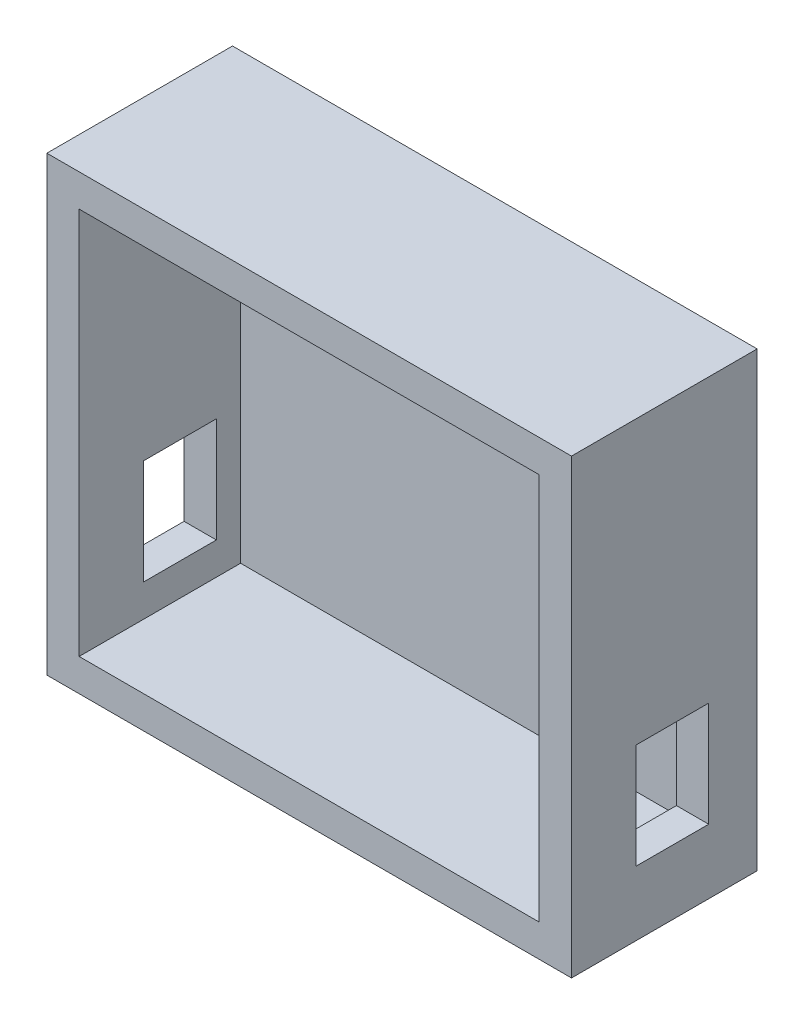
ISO-10303-21;
HEADER;
FILE_DESCRIPTION(('STEP AP214'),'2;1');
FILE_NAME('part.step','',(''),(''),'','','');
FILE_SCHEMA(('AUTOMOTIVE_DESIGN { 1 0 10303 214 1 1 1 1 }'));
ENDSEC;
DATA;
#1=APPLICATION_CONTEXT('core data for automotive mechanical design processes');
#2=APPLICATION_PROTOCOL_DEFINITION('international standard','automotive_design',2000,#1);
#3=PRODUCT_CONTEXT('',#1,'mechanical');
#4=PRODUCT('Part','Part','',(#3));
#5=PRODUCT_RELATED_PRODUCT_CATEGORY('part','',(#4));
#6=PRODUCT_DEFINITION_FORMATION('','',#4);
#7=PRODUCT_DEFINITION_CONTEXT('part definition',#1,'design');
#8=PRODUCT_DEFINITION('design','',#6,#7);
#9=PRODUCT_DEFINITION_SHAPE('','',#8);
#10=(LENGTH_UNIT() NAMED_UNIT(*) SI_UNIT(.MILLI.,.METRE.));
#11=(NAMED_UNIT(*) PLANE_ANGLE_UNIT() SI_UNIT($,.RADIAN.));
#12=(NAMED_UNIT(*) SI_UNIT($,.STERADIAN.) SOLID_ANGLE_UNIT());
#13=UNCERTAINTY_MEASURE_WITH_UNIT(LENGTH_MEASURE(1.E-05),#10,'distance_accuracy_value','');
#14=(GEOMETRIC_REPRESENTATION_CONTEXT(3) GLOBAL_UNCERTAINTY_ASSIGNED_CONTEXT((#13)) GLOBAL_UNIT_ASSIGNED_CONTEXT((#10,
#11,#12)) REPRESENTATION_CONTEXT('',''));
#15=CARTESIAN_POINT('',(0.,0.,0.));
#16=DIRECTION('',(0.,0.,1.));
#17=DIRECTION('',(1.,0.,0.));
#18=AXIS2_PLACEMENT_3D('',#15,#16,#17);
#19=CARTESIAN_POINT('',(32.5,28.,23.));
#20=DIRECTION('',(-1.,0.,0.));
#21=DIRECTION('',(0.,0.,1.));
#22=AXIS2_PLACEMENT_3D('',#19,#20,#21);
#23=PLANE('',#22);
#24=DIRECTION('',(0.,0.,-1.));
#25=VECTOR('',#24,1.);
#26=CARTESIAN_POINT('',(32.5,-6.99999999999998,15.));
#27=LINE('',#26,#25);
#28=CARTESIAN_POINT('',(32.5,-6.99999999999998,15.));
#29=VERTEX_POINT('',#28);
#30=CARTESIAN_POINT('',(32.5,-6.99999999999998,6.));
#31=VERTEX_POINT('',#30);
#32=EDGE_CURVE('E169',#29,#31,#27,.T.);
#33=ORIENTED_EDGE('',*,*,#32,.T.);
#34=DIRECTION('',(0.,-1.,0.));
#35=VECTOR('',#34,1.);
#36=CARTESIAN_POINT('',(32.5,-6.99999999999998,6.));
#37=LINE('',#36,#35);
#38=CARTESIAN_POINT('',(32.5,-20.,6.));
#39=VERTEX_POINT('',#38);
#40=EDGE_CURVE('E152',#31,#39,#37,.T.);
#41=ORIENTED_EDGE('',*,*,#40,.T.);
#42=DIRECTION('',(0.,0.,1.));
#43=VECTOR('',#42,1.);
#44=CARTESIAN_POINT('',(32.5,-20.,15.));
#45=LINE('',#44,#43);
#46=CARTESIAN_POINT('',(32.5,-20.,15.));
#47=VERTEX_POINT('',#46);
#48=EDGE_CURVE('E162',#39,#47,#45,.T.);
#49=ORIENTED_EDGE('',*,*,#48,.T.);
#50=DIRECTION('',(0.,1.,0.));
#51=VECTOR('',#50,1.);
#52=CARTESIAN_POINT('',(32.5,-6.99999999999998,15.));
#53=LINE('',#52,#51);
#54=EDGE_CURVE('E47',#47,#29,#53,.T.);
#55=ORIENTED_EDGE('',*,*,#54,.T.);
#56=EDGE_LOOP('',(#33,#41,#49,#55));
#57=FACE_BOUND('',#56,.T.);
#58=DIRECTION('',(0.,1.,0.));
#59=VECTOR('',#58,1.);
#60=CARTESIAN_POINT('',(32.5,28.,0.));
#61=LINE('',#60,#59);
#62=CARTESIAN_POINT('',(32.5,-28.,0.));
#63=VERTEX_POINT('',#62);
#64=CARTESIAN_POINT('',(32.5,28.,0.));
#65=VERTEX_POINT('',#64);
#66=EDGE_CURVE('E227',#63,#65,#61,.T.);
#67=ORIENTED_EDGE('',*,*,#66,.T.);
#68=DIRECTION('',(0.,0.,-1.));
#69=VECTOR('',#68,1.);
#70=CARTESIAN_POINT('',(32.5,28.,23.));
#71=LINE('',#70,#69);
#72=CARTESIAN_POINT('',(32.5,28.,23.));
#73=VERTEX_POINT('',#72);
#74=EDGE_CURVE('E260',#73,#65,#71,.T.);
#75=ORIENTED_EDGE('',*,*,#74,.F.);
#76=DIRECTION('',(0.,1.,0.));
#77=VECTOR('',#76,1.);
#78=CARTESIAN_POINT('',(32.5,28.,23.));
#79=LINE('',#78,#77);
#80=CARTESIAN_POINT('',(32.5,-28.,23.));
#81=VERTEX_POINT('',#80);
#82=EDGE_CURVE('E234',#81,#73,#79,.T.);
#83=ORIENTED_EDGE('',*,*,#82,.F.);
#84=DIRECTION('',(0.,0.,-1.));
#85=VECTOR('',#84,1.);
#86=CARTESIAN_POINT('',(32.5,-28.,23.));
#87=LINE('',#86,#85);
#88=EDGE_CURVE('E244',#81,#63,#87,.T.);
#89=ORIENTED_EDGE('',*,*,#88,.T.);
#90=EDGE_LOOP('',(#67,#75,#83,#89));
#91=FACE_BOUND('',#90,.T.);
#92=ADVANCED_FACE('F33',(#57,#91),#23,.F.);
#93=CARTESIAN_POINT('',(-32.5,28.,23.));
#94=DIRECTION('',(0.,-1.,0.));
#95=DIRECTION('',(0.,0.,-1.));
#96=AXIS2_PLACEMENT_3D('',#93,#94,#95);
#97=PLANE('',#96);
#98=DIRECTION('',(-1.,0.,0.));
#99=VECTOR('',#98,1.);
#100=CARTESIAN_POINT('',(-32.5,28.,0.));
#101=LINE('',#100,#99);
#102=CARTESIAN_POINT('',(-32.5,28.,0.));
#103=VERTEX_POINT('',#102);
#104=EDGE_CURVE('E247',#65,#103,#101,.T.);
#105=ORIENTED_EDGE('',*,*,#104,.T.);
#106=DIRECTION('',(0.,0.,-1.));
#107=VECTOR('',#106,1.);
#108=CARTESIAN_POINT('',(-32.5,28.,23.));
#109=LINE('',#108,#107);
#110=CARTESIAN_POINT('',(-32.5,28.,23.));
#111=VERTEX_POINT('',#110);
#112=EDGE_CURVE('E257',#111,#103,#109,.T.);
#113=ORIENTED_EDGE('',*,*,#112,.F.);
#114=DIRECTION('',(-1.,0.,0.));
#115=VECTOR('',#114,1.);
#116=CARTESIAN_POINT('',(-32.5,28.,23.));
#117=LINE('',#116,#115);
#118=EDGE_CURVE('E237',#73,#111,#117,.T.);
#119=ORIENTED_EDGE('',*,*,#118,.F.);
#120=ORIENTED_EDGE('',*,*,#74,.T.);
#121=EDGE_LOOP('',(#105,#113,#119,#120));
#122=FACE_BOUND('',#121,.T.);
#123=ADVANCED_FACE('F299',(#122),#97,.F.);
#124=CARTESIAN_POINT('',(-32.5,28.,23.));
#125=DIRECTION('',(1.,0.,0.));
#126=DIRECTION('',(0.,1.,0.));
#127=AXIS2_PLACEMENT_3D('',#124,#125,#126);
#128=PLANE('',#127);
#129=DIRECTION('',(0.,0.,1.));
#130=VECTOR('',#129,1.);
#131=CARTESIAN_POINT('',(-32.5,-20.,15.));
#132=LINE('',#131,#130);
#133=CARTESIAN_POINT('',(-32.5,-20.,6.));
#134=VERTEX_POINT('',#133);
#135=CARTESIAN_POINT('',(-32.5,-20.,15.));
#136=VERTEX_POINT('',#135);
#137=EDGE_CURVE('E179',#134,#136,#132,.T.);
#138=ORIENTED_EDGE('',*,*,#137,.F.);
#139=DIRECTION('',(0.,-1.,0.));
#140=VECTOR('',#139,1.);
#141=CARTESIAN_POINT('',(-32.5,-7.,6.));
#142=LINE('',#141,#140);
#143=CARTESIAN_POINT('',(-32.5,-7.,6.));
#144=VERTEX_POINT('',#143);
#145=EDGE_CURVE('E55',#144,#134,#142,.T.);
#146=ORIENTED_EDGE('',*,*,#145,.F.);
#147=DIRECTION('',(0.,0.,-1.));
#148=VECTOR('',#147,1.);
#149=CARTESIAN_POINT('',(-32.5,-6.99999999999999,15.));
#150=LINE('',#149,#148);
#151=CARTESIAN_POINT('',(-32.5,-6.99999999999999,15.));
#152=VERTEX_POINT('',#151);
#153=EDGE_CURVE('E170',#152,#144,#150,.T.);
#154=ORIENTED_EDGE('',*,*,#153,.F.);
#155=DIRECTION('',(0.,1.,0.));
#156=VECTOR('',#155,1.);
#157=CARTESIAN_POINT('',(-32.5,-6.99999999999999,15.));
#158=LINE('',#157,#156);
#159=EDGE_CURVE('E173',#136,#152,#158,.T.);
#160=ORIENTED_EDGE('',*,*,#159,.F.);
#161=EDGE_LOOP('',(#138,#146,#154,#160));
#162=FACE_BOUND('',#161,.T.);
#163=DIRECTION('',(0.,-1.,0.));
#164=VECTOR('',#163,1.);
#165=CARTESIAN_POINT('',(-32.5,28.,0.));
#166=LINE('',#165,#164);
#167=CARTESIAN_POINT('',(-32.5,-28.,0.));
#168=VERTEX_POINT('',#167);
#169=EDGE_CURVE('E249',#103,#168,#166,.T.);
#170=ORIENTED_EDGE('',*,*,#169,.T.);
#171=DIRECTION('',(0.,0.,-1.));
#172=VECTOR('',#171,1.);
#173=CARTESIAN_POINT('',(-32.5,-28.,23.));
#174=LINE('',#173,#172);
#175=CARTESIAN_POINT('',(-32.5,-28.,23.));
#176=VERTEX_POINT('',#175);
#177=EDGE_CURVE('E254',#176,#168,#174,.T.);
#178=ORIENTED_EDGE('',*,*,#177,.F.);
#179=DIRECTION('',(0.,-1.,0.));
#180=VECTOR('',#179,1.);
#181=CARTESIAN_POINT('',(-32.5,28.,23.));
#182=LINE('',#181,#180);
#183=EDGE_CURVE('E240',#111,#176,#182,.T.);
#184=ORIENTED_EDGE('',*,*,#183,.F.);
#185=ORIENTED_EDGE('',*,*,#112,.T.);
#186=EDGE_LOOP('',(#170,#178,#184,#185));
#187=FACE_BOUND('',#186,.T.);
#188=ADVANCED_FACE('F283',(#162,#187),#128,.F.);
#189=CARTESIAN_POINT('',(-32.5,-28.,23.));
#190=DIRECTION('',(0.,1.,0.));
#191=DIRECTION('',(0.,0.,1.));
#192=AXIS2_PLACEMENT_3D('',#189,#190,#191);
#193=PLANE('',#192);
#194=DIRECTION('',(1.,0.,0.));
#195=VECTOR('',#194,1.);
#196=CARTESIAN_POINT('',(-32.5,-28.,0.));
#197=LINE('',#196,#195);
#198=EDGE_CURVE('E238',#168,#63,#197,.T.);
#199=ORIENTED_EDGE('',*,*,#198,.T.);
#200=ORIENTED_EDGE('',*,*,#88,.F.);
#201=DIRECTION('',(1.,0.,0.));
#202=VECTOR('',#201,1.);
#203=CARTESIAN_POINT('',(-32.5,-28.,23.));
#204=LINE('',#203,#202);
#205=EDGE_CURVE('E242',#176,#81,#204,.T.);
#206=ORIENTED_EDGE('',*,*,#205,.F.);
#207=ORIENTED_EDGE('',*,*,#177,.T.);
#208=EDGE_LOOP('',(#199,#200,#206,#207));
#209=FACE_BOUND('',#208,.T.);
#210=ADVANCED_FACE('F307',(#209),#193,.F.);
#211=CARTESIAN_POINT('',(0.,0.,23.));
#212=DIRECTION('',(0.,0.,1.));
#213=DIRECTION('',(1.,0.,0.));
#214=AXIS2_PLACEMENT_3D('',#211,#212,#213);
#215=PLANE('',#214);
#216=DIRECTION('',(0.,1.,0.));
#217=VECTOR('',#216,1.);
#218=CARTESIAN_POINT('',(28.5,24.,23.));
#219=LINE('',#218,#217);
#220=CARTESIAN_POINT('',(28.5,-24.,23.));
#221=VERTEX_POINT('',#220);
#222=CARTESIAN_POINT('',(28.5,24.,23.));
#223=VERTEX_POINT('',#222);
#224=EDGE_CURVE('E201',#221,#223,#219,.T.);
#225=ORIENTED_EDGE('',*,*,#224,.F.);
#226=DIRECTION('',(1.,0.,0.));
#227=VECTOR('',#226,1.);
#228=CARTESIAN_POINT('',(-28.5,-24.,23.));
#229=LINE('',#228,#227);
#230=CARTESIAN_POINT('',(-28.5,-24.,23.));
#231=VERTEX_POINT('',#230);
#232=EDGE_CURVE('E206',#231,#221,#229,.T.);
#233=ORIENTED_EDGE('',*,*,#232,.F.);
#234=DIRECTION('',(0.,-1.,0.));
#235=VECTOR('',#234,1.);
#236=CARTESIAN_POINT('',(-28.5,24.,23.));
#237=LINE('',#236,#235);
#238=CARTESIAN_POINT('',(-28.5,24.,23.));
#239=VERTEX_POINT('',#238);
#240=EDGE_CURVE('E220',#239,#231,#237,.T.);
#241=ORIENTED_EDGE('',*,*,#240,.F.);
#242=DIRECTION('',(-1.,0.,0.));
#243=VECTOR('',#242,1.);
#244=CARTESIAN_POINT('',(-28.5,24.,23.));
#245=LINE('',#244,#243);
#246=EDGE_CURVE('E217',#223,#239,#245,.T.);
#247=ORIENTED_EDGE('',*,*,#246,.F.);
#248=EDGE_LOOP('',(#225,#233,#241,#247));
#249=FACE_BOUND('',#248,.T.);
#250=ORIENTED_EDGE('',*,*,#82,.T.);
#251=ORIENTED_EDGE('',*,*,#118,.T.);
#252=ORIENTED_EDGE('',*,*,#183,.T.);
#253=ORIENTED_EDGE('',*,*,#205,.T.);
#254=EDGE_LOOP('',(#250,#251,#252,#253));
#255=FACE_BOUND('',#254,.T.);
#256=ADVANCED_FACE('F312',(#249,#255),#215,.T.);
#257=CARTESIAN_POINT('',(0.,0.,0.));
#258=DIRECTION('',(0.,0.,1.));
#259=DIRECTION('',(1.,0.,0.));
#260=AXIS2_PLACEMENT_3D('',#257,#258,#259);
#261=PLANE('',#260);
#262=ORIENTED_EDGE('',*,*,#66,.F.);
#263=ORIENTED_EDGE('',*,*,#198,.F.);
#264=ORIENTED_EDGE('',*,*,#169,.F.);
#265=ORIENTED_EDGE('',*,*,#104,.F.);
#266=EDGE_LOOP('',(#262,#263,#264,#265));
#267=FACE_BOUND('',#266,.T.);
#268=ADVANCED_FACE('F314',(#267),#261,.F.);
#269=CARTESIAN_POINT('',(28.5,24.,3.));
#270=DIRECTION('',(1.,0.,0.));
#271=DIRECTION('',(0.,0.,-1.));
#272=AXIS2_PLACEMENT_3D('',#269,#270,#271);
#273=PLANE('',#272);
#274=DIRECTION('',(0.,0.,-1.));
#275=VECTOR('',#274,1.);
#276=CARTESIAN_POINT('',(28.5,-20.,3.00000000000002));
#277=LINE('',#276,#275);
#278=CARTESIAN_POINT('',(28.5,-20.,15.));
#279=VERTEX_POINT('',#278);
#280=CARTESIAN_POINT('',(28.5,-20.,6.));
#281=VERTEX_POINT('',#280);
#282=EDGE_CURVE('E186',#279,#281,#277,.T.);
#283=ORIENTED_EDGE('',*,*,#282,.T.);
#284=DIRECTION('',(0.,1.,0.));
#285=VECTOR('',#284,1.);
#286=CARTESIAN_POINT('',(28.5,24.,5.99999999999999));
#287=LINE('',#286,#285);
#288=CARTESIAN_POINT('',(28.5,-6.99999999999998,6.));
#289=VERTEX_POINT('',#288);
#290=EDGE_CURVE('E155',#281,#289,#287,.T.);
#291=ORIENTED_EDGE('',*,*,#290,.T.);
#292=DIRECTION('',(0.,0.,1.));
#293=VECTOR('',#292,1.);
#294=CARTESIAN_POINT('',(28.5,-6.99999999999998,3.));
#295=LINE('',#294,#293);
#296=CARTESIAN_POINT('',(28.5,-6.99999999999998,15.));
#297=VERTEX_POINT('',#296);
#298=EDGE_CURVE('E197',#289,#297,#295,.T.);
#299=ORIENTED_EDGE('',*,*,#298,.T.);
#300=DIRECTION('',(0.,-1.,0.));
#301=VECTOR('',#300,1.);
#302=CARTESIAN_POINT('',(28.5,24.,15.));
#303=LINE('',#302,#301);
#304=EDGE_CURVE('E194',#297,#279,#303,.T.);
#305=ORIENTED_EDGE('',*,*,#304,.T.);
#306=EDGE_LOOP('',(#283,#291,#299,#305));
#307=FACE_BOUND('',#306,.T.);
#308=ORIENTED_EDGE('',*,*,#224,.T.);
#309=DIRECTION('',(0.,0.,1.));
#310=VECTOR('',#309,1.);
#311=CARTESIAN_POINT('',(28.5,24.,3.));
#312=LINE('',#311,#310);
#313=CARTESIAN_POINT('',(28.5,24.,3.));
#314=VERTEX_POINT('',#313);
#315=EDGE_CURVE('E215',#314,#223,#312,.T.);
#316=ORIENTED_EDGE('',*,*,#315,.F.);
#317=DIRECTION('',(0.,1.,0.));
#318=VECTOR('',#317,1.);
#319=CARTESIAN_POINT('',(28.5,24.,3.));
#320=LINE('',#319,#318);
#321=CARTESIAN_POINT('',(28.5,-24.,3.));
#322=VERTEX_POINT('',#321);
#323=EDGE_CURVE('E202',#322,#314,#320,.T.);
#324=ORIENTED_EDGE('',*,*,#323,.F.);
#325=DIRECTION('',(0.,0.,1.));
#326=VECTOR('',#325,1.);
#327=CARTESIAN_POINT('',(28.5,-24.,3.));
#328=LINE('',#327,#326);
#329=EDGE_CURVE('E225',#322,#221,#328,.T.);
#330=ORIENTED_EDGE('',*,*,#329,.T.);
#331=EDGE_LOOP('',(#308,#316,#324,#330));
#332=FACE_BOUND('',#331,.T.);
#333=ADVANCED_FACE('F317',(#307,#332),#273,.F.);
#334=CARTESIAN_POINT('',(-28.5,-24.,3.));
#335=DIRECTION('',(0.,-1.,0.));
#336=DIRECTION('',(0.,0.,-1.));
#337=AXIS2_PLACEMENT_3D('',#334,#335,#336);
#338=PLANE('',#337);
#339=ORIENTED_EDGE('',*,*,#232,.T.);
#340=ORIENTED_EDGE('',*,*,#329,.F.);
#341=DIRECTION('',(1.,0.,0.));
#342=VECTOR('',#341,1.);
#343=CARTESIAN_POINT('',(-28.5,-24.,3.));
#344=LINE('',#343,#342);
#345=CARTESIAN_POINT('',(-28.5,-24.,3.));
#346=VERTEX_POINT('',#345);
#347=EDGE_CURVE('E212',#346,#322,#344,.T.);
#348=ORIENTED_EDGE('',*,*,#347,.F.);
#349=DIRECTION('',(0.,0.,1.));
#350=VECTOR('',#349,1.);
#351=CARTESIAN_POINT('',(-28.5,-24.,3.));
#352=LINE('',#351,#350);
#353=EDGE_CURVE('E228',#346,#231,#352,.T.);
#354=ORIENTED_EDGE('',*,*,#353,.T.);
#355=EDGE_LOOP('',(#339,#340,#348,#354));
#356=FACE_BOUND('',#355,.T.);
#357=ADVANCED_FACE('F324',(#356),#338,.F.);
#358=CARTESIAN_POINT('',(-28.5,24.,3.));
#359=DIRECTION('',(-1.,0.,0.));
#360=DIRECTION('',(0.,0.,1.));
#361=AXIS2_PLACEMENT_3D('',#358,#359,#360);
#362=PLANE('',#361);
#363=DIRECTION('',(0.,0.,-1.));
#364=VECTOR('',#363,1.);
#365=CARTESIAN_POINT('',(-28.5,-6.99999999999999,3.));
#366=LINE('',#365,#364);
#367=CARTESIAN_POINT('',(-28.5,-6.99999999999999,15.));
#368=VERTEX_POINT('',#367);
#369=CARTESIAN_POINT('',(-28.5,-6.99999999999999,6.));
#370=VERTEX_POINT('',#369);
#371=EDGE_CURVE('E40',#368,#370,#366,.T.);
#372=ORIENTED_EDGE('',*,*,#371,.T.);
#373=DIRECTION('',(0.,-1.,0.));
#374=VECTOR('',#373,1.);
#375=CARTESIAN_POINT('',(-28.5,24.,5.99999999999999));
#376=LINE('',#375,#374);
#377=CARTESIAN_POINT('',(-28.5,-20.,6.));
#378=VERTEX_POINT('',#377);
#379=EDGE_CURVE('E11',#370,#378,#376,.T.);
#380=ORIENTED_EDGE('',*,*,#379,.T.);
#381=DIRECTION('',(0.,0.,1.));
#382=VECTOR('',#381,1.);
#383=CARTESIAN_POINT('',(-28.5,-20.,3.00000000000002));
#384=LINE('',#383,#382);
#385=CARTESIAN_POINT('',(-28.5,-20.,15.));
#386=VERTEX_POINT('',#385);
#387=EDGE_CURVE('E263',#378,#386,#384,.T.);
#388=ORIENTED_EDGE('',*,*,#387,.T.);
#389=DIRECTION('',(0.,1.,0.));
#390=VECTOR('',#389,1.);
#391=CARTESIAN_POINT('',(-28.5,24.,15.));
#392=LINE('',#391,#390);
#393=EDGE_CURVE('E266',#386,#368,#392,.T.);
#394=ORIENTED_EDGE('',*,*,#393,.T.);
#395=EDGE_LOOP('',(#372,#380,#388,#394));
#396=FACE_BOUND('',#395,.T.);
#397=ORIENTED_EDGE('',*,*,#240,.T.);
#398=ORIENTED_EDGE('',*,*,#353,.F.);
#399=DIRECTION('',(0.,-1.,0.));
#400=VECTOR('',#399,1.);
#401=CARTESIAN_POINT('',(-28.5,24.,3.));
#402=LINE('',#401,#400);
#403=CARTESIAN_POINT('',(-28.5,24.,3.));
#404=VERTEX_POINT('',#403);
#405=EDGE_CURVE('E209',#404,#346,#402,.T.);
#406=ORIENTED_EDGE('',*,*,#405,.F.);
#407=DIRECTION('',(0.,0.,1.));
#408=VECTOR('',#407,1.);
#409=CARTESIAN_POINT('',(-28.5,24.,3.));
#410=LINE('',#409,#408);
#411=EDGE_CURVE('E230',#404,#239,#410,.T.);
#412=ORIENTED_EDGE('',*,*,#411,.T.);
#413=EDGE_LOOP('',(#397,#398,#406,#412));
#414=FACE_BOUND('',#413,.T.);
#415=ADVANCED_FACE('F270',(#396,#414),#362,.F.);
#416=CARTESIAN_POINT('',(-28.5,24.,3.));
#417=DIRECTION('',(0.,1.,0.));
#418=DIRECTION('',(0.,0.,1.));
#419=AXIS2_PLACEMENT_3D('',#416,#417,#418);
#420=PLANE('',#419);
#421=ORIENTED_EDGE('',*,*,#246,.T.);
#422=ORIENTED_EDGE('',*,*,#411,.F.);
#423=DIRECTION('',(-1.,0.,0.));
#424=VECTOR('',#423,1.);
#425=CARTESIAN_POINT('',(-28.5,24.,3.));
#426=LINE('',#425,#424);
#427=EDGE_CURVE('E205',#314,#404,#426,.T.);
#428=ORIENTED_EDGE('',*,*,#427,.F.);
#429=ORIENTED_EDGE('',*,*,#315,.T.);
#430=EDGE_LOOP('',(#421,#422,#428,#429));
#431=FACE_BOUND('',#430,.T.);
#432=ADVANCED_FACE('F326',(#431),#420,.F.);
#433=CARTESIAN_POINT('',(0.,0.,3.));
#434=DIRECTION('',(0.,0.,1.));
#435=DIRECTION('',(1.,0.,0.));
#436=AXIS2_PLACEMENT_3D('',#433,#434,#435);
#437=PLANE('',#436);
#438=ORIENTED_EDGE('',*,*,#323,.T.);
#439=ORIENTED_EDGE('',*,*,#427,.T.);
#440=ORIENTED_EDGE('',*,*,#405,.T.);
#441=ORIENTED_EDGE('',*,*,#347,.T.);
#442=EDGE_LOOP('',(#438,#439,#440,#441));
#443=FACE_BOUND('',#442,.T.);
#444=ADVANCED_FACE('F329',(#443),#437,.T.);
#445=CARTESIAN_POINT('',(32.5,-20.,15.));
#446=DIRECTION('',(0.,-1.,0.));
#447=DIRECTION('',(0.,0.,-1.));
#448=AXIS2_PLACEMENT_3D('',#445,#446,#447);
#449=PLANE('',#448);
#450=DIRECTION('',(-1.,0.,0.));
#451=VECTOR('',#450,1.);
#452=CARTESIAN_POINT('',(32.5,-20.,6.));
#453=LINE('',#452,#451);
#454=EDGE_CURVE('E159',#378,#134,#453,.T.);
#455=ORIENTED_EDGE('',*,*,#454,.T.);
#456=ORIENTED_EDGE('',*,*,#137,.T.);
#457=DIRECTION('',(-1.,0.,0.));
#458=VECTOR('',#457,1.);
#459=CARTESIAN_POINT('',(32.5,-20.,15.));
#460=LINE('',#459,#458);
#461=EDGE_CURVE('E158',#386,#136,#460,.T.);
#462=ORIENTED_EDGE('',*,*,#461,.F.);
#463=ORIENTED_EDGE('',*,*,#387,.F.);
#464=EDGE_LOOP('',(#455,#456,#462,#463));
#465=FACE_BOUND('',#464,.T.);
#466=ADVANCED_FACE('F286',(#465),#449,.F.);
#467=CARTESIAN_POINT('',(32.5,-6.99999999999998,15.));
#468=DIRECTION('',(0.,0.,1.));
#469=DIRECTION('',(0.,-1.,0.));
#470=AXIS2_PLACEMENT_3D('',#467,#468,#469);
#471=PLANE('',#470);
#472=ORIENTED_EDGE('',*,*,#461,.T.);
#473=ORIENTED_EDGE('',*,*,#159,.T.);
#474=DIRECTION('',(-1.,0.,0.));
#475=VECTOR('',#474,1.);
#476=CARTESIAN_POINT('',(32.5,-6.99999999999998,15.));
#477=LINE('',#476,#475);
#478=EDGE_CURVE('E191',#368,#152,#477,.T.);
#479=ORIENTED_EDGE('',*,*,#478,.F.);
#480=ORIENTED_EDGE('',*,*,#393,.F.);
#481=EDGE_LOOP('',(#472,#473,#479,#480));
#482=FACE_BOUND('',#481,.T.);
#483=ADVANCED_FACE('F278',(#482),#471,.F.);
#484=CARTESIAN_POINT('',(32.5,-6.99999999999998,15.));
#485=DIRECTION('',(0.,1.,0.));
#486=DIRECTION('',(-1.,0.,0.));
#487=AXIS2_PLACEMENT_3D('',#484,#485,#486);
#488=PLANE('',#487);
#489=ORIENTED_EDGE('',*,*,#478,.T.);
#490=ORIENTED_EDGE('',*,*,#153,.T.);
#491=DIRECTION('',(-1.,0.,0.));
#492=VECTOR('',#491,1.);
#493=CARTESIAN_POINT('',(32.5,-6.99999999999998,6.));
#494=LINE('',#493,#492);
#495=EDGE_CURVE('E187',#370,#144,#494,.T.);
#496=ORIENTED_EDGE('',*,*,#495,.F.);
#497=ORIENTED_EDGE('',*,*,#371,.F.);
#498=EDGE_LOOP('',(#489,#490,#496,#497));
#499=FACE_BOUND('',#498,.T.);
#500=ADVANCED_FACE('F276',(#499),#488,.F.);
#501=CARTESIAN_POINT('',(32.5,-6.99999999999998,6.));
#502=DIRECTION('',(0.,0.,-1.));
#503=DIRECTION('',(0.,1.,0.));
#504=AXIS2_PLACEMENT_3D('',#501,#502,#503);
#505=PLANE('',#504);
#506=ORIENTED_EDGE('',*,*,#495,.T.);
#507=ORIENTED_EDGE('',*,*,#145,.T.);
#508=ORIENTED_EDGE('',*,*,#454,.F.);
#509=ORIENTED_EDGE('',*,*,#379,.F.);
#510=EDGE_LOOP('',(#506,#507,#508,#509));
#511=FACE_BOUND('',#510,.T.);
#512=ADVANCED_FACE('F287',(#511),#505,.F.);
#513=EDGE_CURVE('E147',#39,#281,#453,.T.);
#514=ORIENTED_EDGE('',*,*,#513,.F.);
#515=ORIENTED_EDGE('',*,*,#40,.F.);
#516=EDGE_CURVE('E184',#31,#289,#494,.T.);
#517=ORIENTED_EDGE('',*,*,#516,.T.);
#518=ORIENTED_EDGE('',*,*,#290,.F.);
#519=EDGE_LOOP('',(#514,#515,#517,#518));
#520=FACE_BOUND('',#519,.T.);
#521=ADVANCED_FACE('F149',(#520),#505,.F.);
#522=ORIENTED_EDGE('',*,*,#516,.F.);
#523=ORIENTED_EDGE('',*,*,#32,.F.);
#524=EDGE_CURVE('E188',#29,#297,#477,.T.);
#525=ORIENTED_EDGE('',*,*,#524,.T.);
#526=ORIENTED_EDGE('',*,*,#298,.F.);
#527=EDGE_LOOP('',(#522,#523,#525,#526));
#528=FACE_BOUND('',#527,.T.);
#529=ADVANCED_FACE('F294',(#528),#488,.F.);
#530=ORIENTED_EDGE('',*,*,#524,.F.);
#531=ORIENTED_EDGE('',*,*,#54,.F.);
#532=EDGE_CURVE('E164',#47,#279,#460,.T.);
#533=ORIENTED_EDGE('',*,*,#532,.T.);
#534=ORIENTED_EDGE('',*,*,#304,.F.);
#535=EDGE_LOOP('',(#530,#531,#533,#534));
#536=FACE_BOUND('',#535,.T.);
#537=ADVANCED_FACE('F364',(#536),#471,.F.);
#538=ORIENTED_EDGE('',*,*,#532,.F.);
#539=ORIENTED_EDGE('',*,*,#48,.F.);
#540=ORIENTED_EDGE('',*,*,#513,.T.);
#541=ORIENTED_EDGE('',*,*,#282,.F.);
#542=EDGE_LOOP('',(#538,#539,#540,#541));
#543=FACE_BOUND('',#542,.T.);
#544=ADVANCED_FACE('F163',(#543),#449,.F.);
#545=CLOSED_SHELL('',(#92,#123,#188,#210,#256,#268,#333,#357,#415,#432,#444,#466,#483,#500,#512,
#521,#529,#537,#544));
#546=MANIFOLD_SOLID_BREP('B2',#545);
#547=ADVANCED_BREP_SHAPE_REPRESENTATION('',(#18,#546),#14);
#548=SHAPE_DEFINITION_REPRESENTATION(#9,#547);
ENDSEC;
END-ISO-10303-21;
